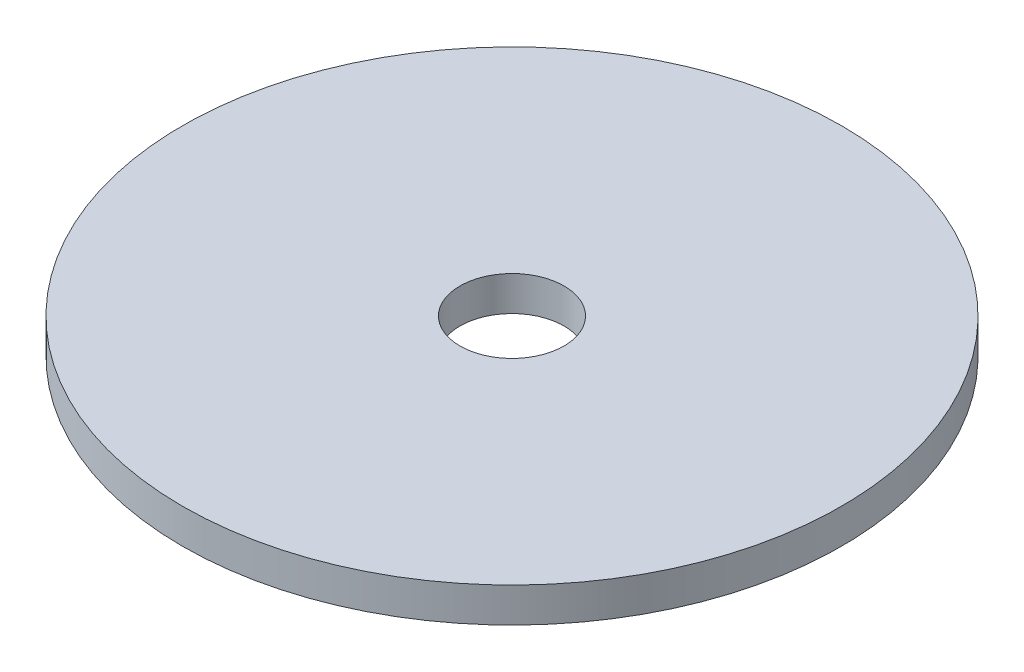
ISO-10303-21;
HEADER;
FILE_DESCRIPTION(('STEP AP214'),'2;1');
FILE_NAME('part.step','',(''),(''),'','','');
FILE_SCHEMA(('AUTOMOTIVE_DESIGN { 1 0 10303 214 1 1 1 1 }'));
ENDSEC;
DATA;
#1=APPLICATION_CONTEXT('core data for automotive mechanical design processes');
#2=APPLICATION_PROTOCOL_DEFINITION('international standard','automotive_design',2000,#1);
#3=PRODUCT_CONTEXT('',#1,'mechanical');
#4=PRODUCT('Part','Part','',(#3));
#5=PRODUCT_RELATED_PRODUCT_CATEGORY('part','',(#4));
#6=PRODUCT_DEFINITION_FORMATION('','',#4);
#7=PRODUCT_DEFINITION_CONTEXT('part definition',#1,'design');
#8=PRODUCT_DEFINITION('design','',#6,#7);
#9=PRODUCT_DEFINITION_SHAPE('','',#8);
#10=(LENGTH_UNIT() NAMED_UNIT(*) SI_UNIT(.MILLI.,.METRE.));
#11=(NAMED_UNIT(*) PLANE_ANGLE_UNIT() SI_UNIT($,.RADIAN.));
#12=(NAMED_UNIT(*) SI_UNIT($,.STERADIAN.) SOLID_ANGLE_UNIT());
#13=UNCERTAINTY_MEASURE_WITH_UNIT(LENGTH_MEASURE(1.E-05),#10,'distance_accuracy_value','');
#14=(GEOMETRIC_REPRESENTATION_CONTEXT(3) GLOBAL_UNCERTAINTY_ASSIGNED_CONTEXT((#13)) GLOBAL_UNIT_ASSIGNED_CONTEXT((#10,
#11,#12)) REPRESENTATION_CONTEXT('',''));
#15=CARTESIAN_POINT('',(0.,0.,0.));
#16=DIRECTION('',(0.,0.,1.));
#17=DIRECTION('',(1.,0.,0.));
#18=AXIS2_PLACEMENT_3D('',#15,#16,#17);
#19=CARTESIAN_POINT('',(0.,-0.5,0.));
#20=DIRECTION('',(0.,1.,0.));
#21=DIRECTION('',(0.,0.,1.));
#22=AXIS2_PLACEMENT_3D('',#19,#20,#21);
#23=CYLINDRICAL_SURFACE('',#22,4.75);
#24=CARTESIAN_POINT('',(0.,-0.5,0.));
#25=DIRECTION('',(0.,1.,0.));
#26=DIRECTION('',(0.,0.,1.));
#27=AXIS2_PLACEMENT_3D('',#24,#25,#26);
#28=CIRCLE('',#27,4.75);
#29=CARTESIAN_POINT('',(0.,-0.5,4.75));
#30=VERTEX_POINT('',#29);
#31=EDGE_CURVE('E11',#30,#30,#28,.T.);
#32=ORIENTED_EDGE('',*,*,#31,.T.);
#33=EDGE_LOOP('',(#32));
#34=FACE_BOUND('',#33,.T.);
#35=CARTESIAN_POINT('',(0.,0.,0.));
#36=DIRECTION('',(0.,1.,0.));
#37=DIRECTION('',(0.,0.,1.));
#38=AXIS2_PLACEMENT_3D('',#35,#36,#37);
#39=CIRCLE('',#38,4.75);
#40=CARTESIAN_POINT('',(0.,0.,4.75));
#41=VERTEX_POINT('',#40);
#42=EDGE_CURVE('E40',#41,#41,#39,.T.);
#43=ORIENTED_EDGE('',*,*,#42,.F.);
#44=EDGE_LOOP('',(#43));
#45=FACE_BOUND('',#44,.T.);
#46=ADVANCED_FACE('F37',(#34,#45),#23,.T.);
#47=CARTESIAN_POINT('',(0.,-0.5,0.));
#48=DIRECTION('',(0.,1.,0.));
#49=DIRECTION('',(0.,0.,1.));
#50=AXIS2_PLACEMENT_3D('',#47,#48,#49);
#51=PLANE('',#50);
#52=CARTESIAN_POINT('',(0.,-0.5,0.));
#53=DIRECTION('',(0.,1.,0.));
#54=DIRECTION('',(0.,0.,1.));
#55=AXIS2_PLACEMENT_3D('',#52,#53,#54);
#56=CIRCLE('',#55,0.75);
#57=CARTESIAN_POINT('',(0.,-0.5,0.75));
#58=VERTEX_POINT('',#57);
#59=EDGE_CURVE('E47',#58,#58,#56,.T.);
#60=ORIENTED_EDGE('',*,*,#59,.T.);
#61=EDGE_LOOP('',(#60));
#62=FACE_BOUND('',#61,.T.);
#63=ORIENTED_EDGE('',*,*,#31,.F.);
#64=EDGE_LOOP('',(#63));
#65=FACE_BOUND('',#64,.T.);
#66=ADVANCED_FACE('F55',(#62,#65),#51,.F.);
#67=CARTESIAN_POINT('',(0.,0.,0.));
#68=DIRECTION('',(0.,1.,0.));
#69=DIRECTION('',(0.,0.,1.));
#70=AXIS2_PLACEMENT_3D('',#67,#68,#69);
#71=PLANE('',#70);
#72=CARTESIAN_POINT('',(0.,0.,0.));
#73=DIRECTION('',(0.,1.,0.));
#74=DIRECTION('',(0.,0.,1.));
#75=AXIS2_PLACEMENT_3D('',#72,#73,#74);
#76=CIRCLE('',#75,0.75);
#77=CARTESIAN_POINT('',(0.,0.,0.75));
#78=VERTEX_POINT('',#77);
#79=EDGE_CURVE('E49',#78,#78,#76,.T.);
#80=ORIENTED_EDGE('',*,*,#79,.F.);
#81=EDGE_LOOP('',(#80));
#82=FACE_BOUND('',#81,.T.);
#83=ORIENTED_EDGE('',*,*,#42,.T.);
#84=EDGE_LOOP('',(#83));
#85=FACE_BOUND('',#84,.T.);
#86=ADVANCED_FACE('F61',(#82,#85),#71,.T.);
#87=CARTESIAN_POINT('',(0.,-0.5,0.));
#88=DIRECTION('',(0.,1.,0.));
#89=DIRECTION('',(0.,0.,1.));
#90=AXIS2_PLACEMENT_3D('',#87,#88,#89);
#91=CYLINDRICAL_SURFACE('',#90,0.75);
#92=ORIENTED_EDGE('',*,*,#59,.F.);
#93=EDGE_LOOP('',(#92));
#94=FACE_BOUND('',#93,.T.);
#95=ORIENTED_EDGE('',*,*,#79,.T.);
#96=EDGE_LOOP('',(#95));
#97=FACE_BOUND('',#96,.T.);
#98=ADVANCED_FACE('F58',(#94,#97),#91,.F.);
#99=CLOSED_SHELL('',(#46,#66,#86,#98));
#100=MANIFOLD_SOLID_BREP('B2',#99);
#101=ADVANCED_BREP_SHAPE_REPRESENTATION('',(#18,#100),#14);
#102=SHAPE_DEFINITION_REPRESENTATION(#9,#101);
ENDSEC;
END-ISO-10303-21;
